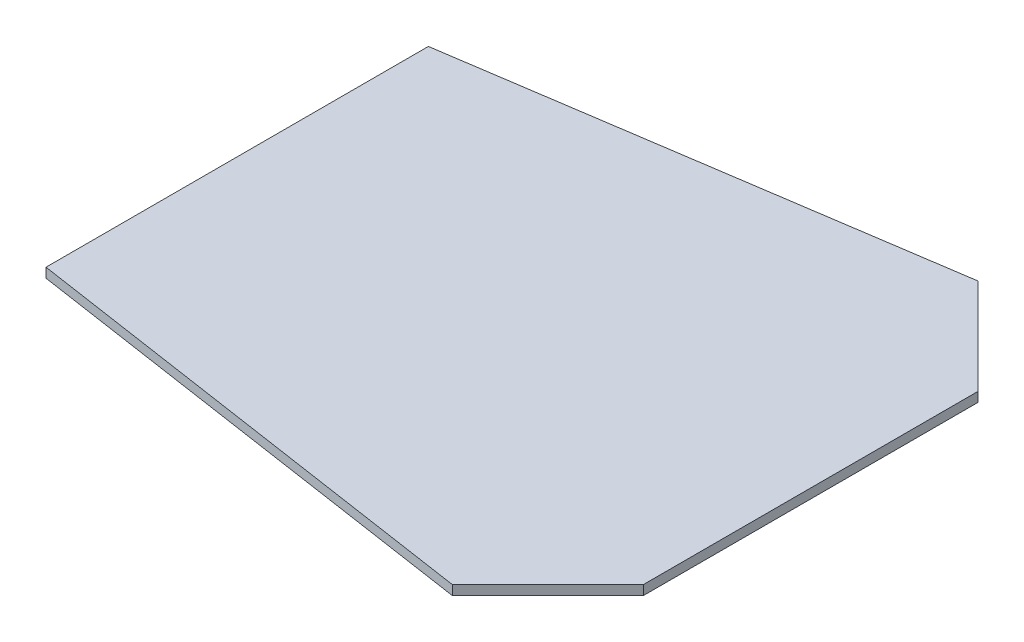
ISO-10303-21;
HEADER;
FILE_DESCRIPTION(('STEP AP214'),'2;1');
FILE_NAME('part.step','',(''),(''),'','','');
FILE_SCHEMA(('AUTOMOTIVE_DESIGN { 1 0 10303 214 1 1 1 1 }'));
ENDSEC;
DATA;
#1=APPLICATION_CONTEXT('core data for automotive mechanical design processes');
#2=APPLICATION_PROTOCOL_DEFINITION('international standard','automotive_design',2000,#1);
#3=PRODUCT_CONTEXT('',#1,'mechanical');
#4=PRODUCT('Part','Part','',(#3));
#5=PRODUCT_RELATED_PRODUCT_CATEGORY('part','',(#4));
#6=PRODUCT_DEFINITION_FORMATION('','',#4);
#7=PRODUCT_DEFINITION_CONTEXT('part definition',#1,'design');
#8=PRODUCT_DEFINITION('design','',#6,#7);
#9=PRODUCT_DEFINITION_SHAPE('','',#8);
#10=(LENGTH_UNIT() NAMED_UNIT(*) SI_UNIT(.MILLI.,.METRE.));
#11=(NAMED_UNIT(*) PLANE_ANGLE_UNIT() SI_UNIT($,.RADIAN.));
#12=(NAMED_UNIT(*) SI_UNIT($,.STERADIAN.) SOLID_ANGLE_UNIT());
#13=UNCERTAINTY_MEASURE_WITH_UNIT(LENGTH_MEASURE(1.E-05),#10,'distance_accuracy_value','');
#14=(GEOMETRIC_REPRESENTATION_CONTEXT(3) GLOBAL_UNCERTAINTY_ASSIGNED_CONTEXT((#13)) GLOBAL_UNIT_ASSIGNED_CONTEXT((#10,
#11,#12)) REPRESENTATION_CONTEXT('',''));
#15=CARTESIAN_POINT('',(0.,0.,0.));
#16=DIRECTION('',(0.,0.,1.));
#17=DIRECTION('',(1.,0.,0.));
#18=AXIS2_PLACEMENT_3D('',#15,#16,#17);
#19=CARTESIAN_POINT('',(440.114852969023,10.,-512.96624270284));
#20=DIRECTION('',(-0.707106781186547,0.,0.707106781186548));
#21=DIRECTION('',(0.707106781186548,0.,0.707106781186547));
#22=AXIS2_PLACEMENT_3D('',#19,#20,#21);
#23=PLANE('',#22);
#24=DIRECTION('',(-0.707106781186548,0.,-0.707106781186547));
#25=VECTOR('',#24,1.);
#26=CARTESIAN_POINT('',(440.114852969023,0.,-512.96624270284));
#27=LINE('',#26,#25);
#28=CARTESIAN_POINT('',(540.114852969023,0.,-412.96624270284));
#29=VERTEX_POINT('',#28);
#30=CARTESIAN_POINT('',(440.114852969023,0.,-512.96624270284));
#31=VERTEX_POINT('',#30);
#32=EDGE_CURVE('E118',#29,#31,#27,.T.);
#33=ORIENTED_EDGE('',*,*,#32,.T.);
#34=DIRECTION('',(0.,-1.,0.));
#35=VECTOR('',#34,1.);
#36=CARTESIAN_POINT('',(440.114852969023,10.,-512.96624270284));
#37=LINE('',#36,#35);
#38=CARTESIAN_POINT('',(440.114852969023,10.,-512.96624270284));
#39=VERTEX_POINT('',#38);
#40=EDGE_CURVE('E11',#39,#31,#37,.T.);
#41=ORIENTED_EDGE('',*,*,#40,.F.);
#42=DIRECTION('',(-0.707106781186548,0.,-0.707106781186547));
#43=VECTOR('',#42,1.);
#44=CARTESIAN_POINT('',(440.114852969023,10.,-512.96624270284));
#45=LINE('',#44,#43);
#46=CARTESIAN_POINT('',(540.114852969023,10.,-412.96624270284));
#47=VERTEX_POINT('',#46);
#48=EDGE_CURVE('E128',#47,#39,#45,.T.);
#49=ORIENTED_EDGE('',*,*,#48,.F.);
#50=DIRECTION('',(0.,-1.,0.));
#51=VECTOR('',#50,1.);
#52=CARTESIAN_POINT('',(540.114852969023,10.,-412.96624270284));
#53=LINE('',#52,#51);
#54=EDGE_CURVE('E114',#47,#29,#53,.T.);
#55=ORIENTED_EDGE('',*,*,#54,.T.);
#56=EDGE_LOOP('',(#33,#41,#49,#55));
#57=FACE_BOUND('',#56,.T.);
#58=ADVANCED_FACE('F34',(#57),#23,.F.);
#59=CARTESIAN_POINT('',(440.114852969023,10.,-512.96624270284));
#60=DIRECTION('',(0.148340452930245,0.,0.988936352868298));
#61=DIRECTION('',(0.988936352868298,0.,-0.148340452930245));
#62=AXIS2_PLACEMENT_3D('',#59,#60,#61);
#63=PLANE('',#62);
#64=DIRECTION('',(-0.988936352868297,0.,0.148340452930245));
#65=VECTOR('',#64,1.);
#66=CARTESIAN_POINT('',(440.114852969023,0.,-512.96624270284));
#67=LINE('',#66,#65);
#68=CARTESIAN_POINT('',(-59.8851470309775,0.,-437.96624270284));
#69=VERTEX_POINT('',#68);
#70=EDGE_CURVE('E121',#31,#69,#67,.T.);
#71=ORIENTED_EDGE('',*,*,#70,.T.);
#72=DIRECTION('',(0.,-1.,0.));
#73=VECTOR('',#72,1.);
#74=CARTESIAN_POINT('',(-59.8851470309775,10.,-437.96624270284));
#75=LINE('',#74,#73);
#76=CARTESIAN_POINT('',(-59.8851470309775,10.,-437.96624270284));
#77=VERTEX_POINT('',#76);
#78=EDGE_CURVE('E42',#77,#69,#75,.T.);
#79=ORIENTED_EDGE('',*,*,#78,.F.);
#80=DIRECTION('',(-0.988936352868297,0.,0.148340452930245));
#81=VECTOR('',#80,1.);
#82=CARTESIAN_POINT('',(440.114852969023,10.,-512.96624270284));
#83=LINE('',#82,#81);
#84=EDGE_CURVE('E87',#39,#77,#83,.T.);
#85=ORIENTED_EDGE('',*,*,#84,.F.);
#86=ORIENTED_EDGE('',*,*,#40,.T.);
#87=EDGE_LOOP('',(#71,#79,#85,#86));
#88=FACE_BOUND('',#87,.T.);
#89=ADVANCED_FACE('F152',(#88),#63,.F.);
#90=CARTESIAN_POINT('',(-59.8851470309775,10.,-437.96624270284));
#91=DIRECTION('',(1.,0.,0.));
#92=DIRECTION('',(0.,0.,-1.));
#93=AXIS2_PLACEMENT_3D('',#90,#91,#92);
#94=PLANE('',#93);
#95=DIRECTION('',(0.,0.,1.));
#96=VECTOR('',#95,1.);
#97=CARTESIAN_POINT('',(-59.8851470309775,0.,-437.96624270284));
#98=LINE('',#97,#96);
#99=CARTESIAN_POINT('',(-59.8851470309775,0.,-37.9662427028399));
#100=VERTEX_POINT('',#99);
#101=EDGE_CURVE('E123',#69,#100,#98,.T.);
#102=ORIENTED_EDGE('',*,*,#101,.T.);
#103=DIRECTION('',(0.,-1.,0.));
#104=VECTOR('',#103,1.);
#105=CARTESIAN_POINT('',(-59.8851470309775,10.,-37.9662427028399));
#106=LINE('',#105,#104);
#107=CARTESIAN_POINT('',(-59.8851470309775,10.,-37.9662427028399));
#108=VERTEX_POINT('',#107);
#109=EDGE_CURVE('E109',#108,#100,#106,.T.);
#110=ORIENTED_EDGE('',*,*,#109,.F.);
#111=DIRECTION('',(0.,0.,1.));
#112=VECTOR('',#111,1.);
#113=CARTESIAN_POINT('',(-59.8851470309775,10.,-437.96624270284));
#114=LINE('',#113,#112);
#115=EDGE_CURVE('E100',#77,#108,#114,.T.);
#116=ORIENTED_EDGE('',*,*,#115,.F.);
#117=ORIENTED_EDGE('',*,*,#78,.T.);
#118=EDGE_LOOP('',(#102,#110,#116,#117));
#119=FACE_BOUND('',#118,.T.);
#120=ADVANCED_FACE('F134',(#119),#94,.F.);
#121=CARTESIAN_POINT('',(440.114852969023,10.,37.0337572971603));
#122=DIRECTION('',(0.148340452930245,0.,-0.988936352868298));
#123=DIRECTION('',(-0.988936352868298,0.,-0.148340452930245));
#124=AXIS2_PLACEMENT_3D('',#121,#122,#123);
#125=PLANE('',#124);
#126=DIRECTION('',(0.988936352868297,0.,0.148340452930245));
#127=VECTOR('',#126,1.);
#128=CARTESIAN_POINT('',(440.114852969023,0.,37.0337572971603));
#129=LINE('',#128,#127);
#130=CARTESIAN_POINT('',(440.114852969023,0.,37.0337572971603));
#131=VERTEX_POINT('',#130);
#132=EDGE_CURVE('E108',#100,#131,#129,.T.);
#133=ORIENTED_EDGE('',*,*,#132,.T.);
#134=DIRECTION('',(0.,-1.,0.));
#135=VECTOR('',#134,1.);
#136=CARTESIAN_POINT('',(440.114852969023,10.,37.0337572971603));
#137=LINE('',#136,#135);
#138=CARTESIAN_POINT('',(440.114852969023,10.,37.0337572971603));
#139=VERTEX_POINT('',#138);
#140=EDGE_CURVE('E105',#139,#131,#137,.T.);
#141=ORIENTED_EDGE('',*,*,#140,.F.);
#142=DIRECTION('',(0.988936352868297,0.,0.148340452930245));
#143=VECTOR('',#142,1.);
#144=CARTESIAN_POINT('',(440.114852969023,10.,37.0337572971603));
#145=LINE('',#144,#143);
#146=EDGE_CURVE('E94',#108,#139,#145,.T.);
#147=ORIENTED_EDGE('',*,*,#146,.F.);
#148=ORIENTED_EDGE('',*,*,#109,.T.);
#149=EDGE_LOOP('',(#133,#141,#147,#148));
#150=FACE_BOUND('',#149,.T.);
#151=ADVANCED_FACE('F106',(#150),#125,.F.);
#152=CARTESIAN_POINT('',(440.114852969023,10.,37.0337572971603));
#153=DIRECTION('',(-0.707106781186547,0.,-0.707106781186548));
#154=DIRECTION('',(-0.707106781186548,0.,0.707106781186547));
#155=AXIS2_PLACEMENT_3D('',#152,#153,#154);
#156=PLANE('',#155);
#157=DIRECTION('',(0.707106781186548,0.,-0.707106781186547));
#158=VECTOR('',#157,1.);
#159=CARTESIAN_POINT('',(440.114852969023,0.,37.0337572971603));
#160=LINE('',#159,#158);
#161=CARTESIAN_POINT('',(540.114852969023,0.,-62.9662427028395));
#162=VERTEX_POINT('',#161);
#163=EDGE_CURVE('E73',#131,#162,#160,.T.);
#164=ORIENTED_EDGE('',*,*,#163,.T.);
#165=DIRECTION('',(0.,-1.,0.));
#166=VECTOR('',#165,1.);
#167=CARTESIAN_POINT('',(540.114852969023,10.,-62.9662427028395));
#168=LINE('',#167,#166);
#169=CARTESIAN_POINT('',(540.114852969023,10.,-62.9662427028395));
#170=VERTEX_POINT('',#169);
#171=EDGE_CURVE('E110',#170,#162,#168,.T.);
#172=ORIENTED_EDGE('',*,*,#171,.F.);
#173=DIRECTION('',(0.707106781186548,0.,-0.707106781186547));
#174=VECTOR('',#173,1.);
#175=CARTESIAN_POINT('',(440.114852969023,10.,37.0337572971603));
#176=LINE('',#175,#174);
#177=EDGE_CURVE('E98',#139,#170,#176,.T.);
#178=ORIENTED_EDGE('',*,*,#177,.F.);
#179=ORIENTED_EDGE('',*,*,#140,.T.);
#180=EDGE_LOOP('',(#164,#172,#178,#179));
#181=FACE_BOUND('',#180,.T.);
#182=ADVANCED_FACE('F112',(#181),#156,.F.);
#183=CARTESIAN_POINT('',(540.114852969023,10.,-62.9662427028395));
#184=DIRECTION('',(-1.,0.,0.));
#185=DIRECTION('',(0.,0.,1.));
#186=AXIS2_PLACEMENT_3D('',#183,#184,#185);
#187=PLANE('',#186);
#188=DIRECTION('',(0.,0.,-1.));
#189=VECTOR('',#188,1.);
#190=CARTESIAN_POINT('',(540.114852969023,0.,-62.9662427028395));
#191=LINE('',#190,#189);
#192=EDGE_CURVE('E79',#162,#29,#191,.T.);
#193=ORIENTED_EDGE('',*,*,#192,.T.);
#194=ORIENTED_EDGE('',*,*,#54,.F.);
#195=DIRECTION('',(0.,0.,-1.));
#196=VECTOR('',#195,1.);
#197=CARTESIAN_POINT('',(540.114852969023,10.,-62.9662427028395));
#198=LINE('',#197,#196);
#199=EDGE_CURVE('E50',#170,#47,#198,.T.);
#200=ORIENTED_EDGE('',*,*,#199,.F.);
#201=ORIENTED_EDGE('',*,*,#171,.T.);
#202=EDGE_LOOP('',(#193,#194,#200,#201));
#203=FACE_BOUND('',#202,.T.);
#204=ADVANCED_FACE('F141',(#203),#187,.F.);
#205=CARTESIAN_POINT('',(0.,10.,0.));
#206=DIRECTION('',(0.,1.,0.));
#207=DIRECTION('',(0.,0.,1.));
#208=AXIS2_PLACEMENT_3D('',#205,#206,#207);
#209=PLANE('',#208);
#210=ORIENTED_EDGE('',*,*,#48,.T.);
#211=ORIENTED_EDGE('',*,*,#84,.T.);
#212=ORIENTED_EDGE('',*,*,#115,.T.);
#213=ORIENTED_EDGE('',*,*,#146,.T.);
#214=ORIENTED_EDGE('',*,*,#177,.T.);
#215=ORIENTED_EDGE('',*,*,#199,.T.);
#216=EDGE_LOOP('',(#210,#211,#212,#213,#214,#215));
#217=FACE_BOUND('',#216,.T.);
#218=ADVANCED_FACE('F96',(#217),#209,.T.);
#219=CARTESIAN_POINT('',(0.,0.,0.));
#220=DIRECTION('',(0.,1.,0.));
#221=DIRECTION('',(0.,0.,1.));
#222=AXIS2_PLACEMENT_3D('',#219,#220,#221);
#223=PLANE('',#222);
#224=ORIENTED_EDGE('',*,*,#32,.F.);
#225=ORIENTED_EDGE('',*,*,#192,.F.);
#226=ORIENTED_EDGE('',*,*,#163,.F.);
#227=ORIENTED_EDGE('',*,*,#132,.F.);
#228=ORIENTED_EDGE('',*,*,#101,.F.);
#229=ORIENTED_EDGE('',*,*,#70,.F.);
#230=EDGE_LOOP('',(#224,#225,#226,#227,#228,#229));
#231=FACE_BOUND('',#230,.T.);
#232=ADVANCED_FACE('F137',(#231),#223,.F.);
#233=CLOSED_SHELL('',(#58,#89,#120,#151,#182,#204,#218,#232));
#234=MANIFOLD_SOLID_BREP('B2',#233);
#235=ADVANCED_BREP_SHAPE_REPRESENTATION('',(#18,#234),#14);
#236=SHAPE_DEFINITION_REPRESENTATION(#9,#235);
ENDSEC;
END-ISO-10303-21;
